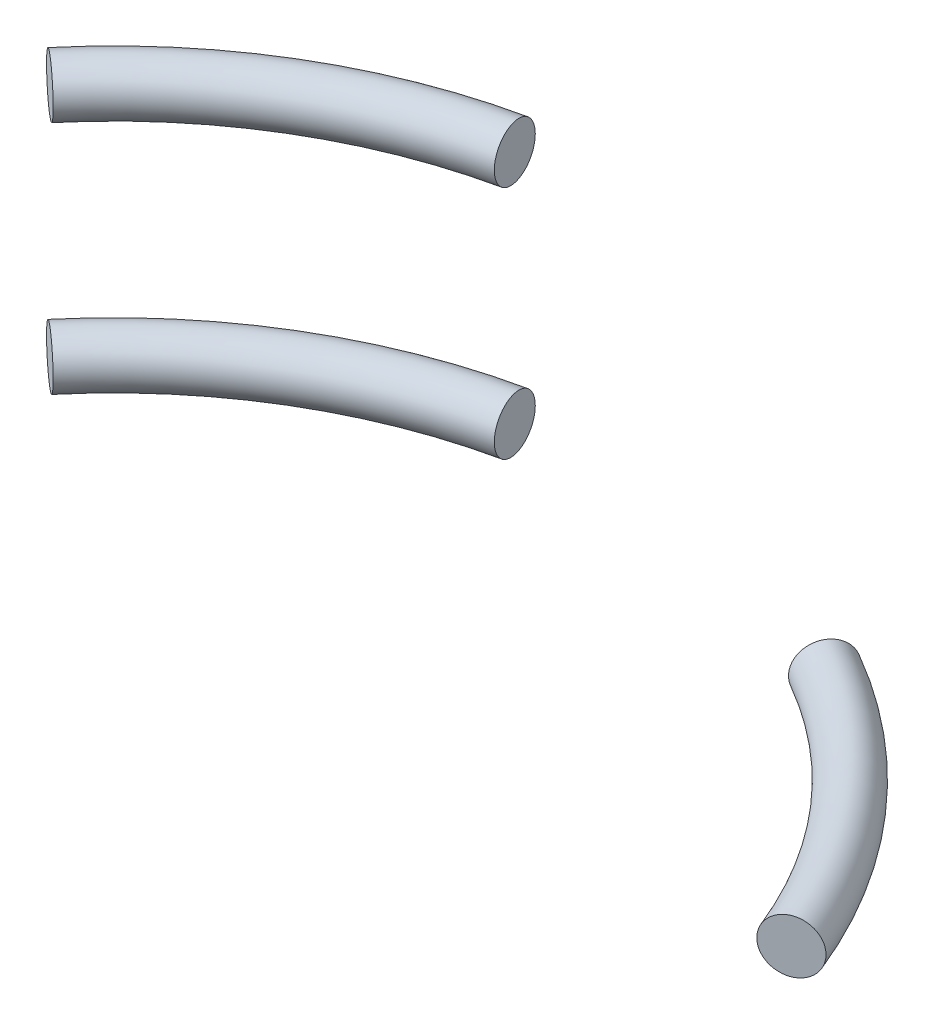
ISO-10303-21;
HEADER;
FILE_DESCRIPTION(('STEP AP214'),'2;1');
FILE_NAME('part.step','',(''),(''),'','','');
FILE_SCHEMA(('AUTOMOTIVE_DESIGN { 1 0 10303 214 1 1 1 1 }'));
ENDSEC;
DATA;
#1=APPLICATION_CONTEXT('core data for automotive mechanical design processes');
#2=APPLICATION_PROTOCOL_DEFINITION('international standard','automotive_design',2000,#1);
#3=PRODUCT_CONTEXT('',#1,'mechanical');
#4=PRODUCT('Part','Part','',(#3));
#5=PRODUCT_RELATED_PRODUCT_CATEGORY('part','',(#4));
#6=PRODUCT_DEFINITION_FORMATION('','',#4);
#7=PRODUCT_DEFINITION_CONTEXT('part definition',#1,'design');
#8=PRODUCT_DEFINITION('design','',#6,#7);
#9=PRODUCT_DEFINITION_SHAPE('','',#8);
#10=(LENGTH_UNIT() NAMED_UNIT(*) SI_UNIT(.MILLI.,.METRE.));
#11=(NAMED_UNIT(*) PLANE_ANGLE_UNIT() SI_UNIT($,.RADIAN.));
#12=(NAMED_UNIT(*) SI_UNIT($,.STERADIAN.) SOLID_ANGLE_UNIT());
#13=UNCERTAINTY_MEASURE_WITH_UNIT(LENGTH_MEASURE(1.E-05),#10,'distance_accuracy_value','');
#14=(GEOMETRIC_REPRESENTATION_CONTEXT(3) GLOBAL_UNCERTAINTY_ASSIGNED_CONTEXT((#13)) GLOBAL_UNIT_ASSIGNED_CONTEXT((#10,
#11,#12)) REPRESENTATION_CONTEXT('',''));
#15=CARTESIAN_POINT('',(0.,0.,0.));
#16=DIRECTION('',(0.,0.,1.));
#17=DIRECTION('',(1.,0.,0.));
#18=AXIS2_PLACEMENT_3D('',#15,#16,#17);
#19=CARTESIAN_POINT('',(0.,5.,0.));
#20=DIRECTION('',(-0.866025403784443,0.,-0.499999999999992));
#21=DIRECTION('',(-0.499999999999992,0.,0.866025403784443));
#22=AXIS2_PLACEMENT_3D('',#19,#20,#21);
#23=PLANE('',#22);
#24=CARTESIAN_POINT('',(3.91249999999994,0.7302,-6.77664878461327));
#25=DIRECTION('',(0.866025403784443,0.,0.499999999999992));
#26=DIRECTION('',(-0.499999999999992,0.,0.866025403784444));
#27=AXIS2_PLACEMENT_3D('',#24,#25,#26);
#28=CIRCLE('',#27,0.4);
#29=CARTESIAN_POINT('',(4.11249999999993,0.7302,-7.12305894612705));
#30=VERTEX_POINT('',#29);
#31=EDGE_CURVE('P0_E18',#30,#30,#28,.T.);
#32=ORIENTED_EDGE('',*,*,#31,.F.);
#33=EDGE_LOOP('',(#32));
#34=FACE_BOUND('',#33,.T.);
#35=ADVANCED_FACE('P0_F15',(#34),#23,.T.);
#36=CARTESIAN_POINT('',(0.,5.,0.));
#37=DIRECTION('',(-0.37460659341592,0.,-0.927183854566784));
#38=DIRECTION('',(-0.927183854566784,0.,0.37460659341592));
#39=AXIS2_PLACEMENT_3D('',#36,#37,#38);
#40=PLANE('',#39);
#41=CARTESIAN_POINT('',(7.25521366198509,0.7302,-2.93129659347957));
#42=DIRECTION('',(0.37460659341592,0.,0.927183854566785));
#43=DIRECTION('',(-0.927183854566785,0.,0.374606593415919));
#44=AXIS2_PLACEMENT_3D('',#41,#42,#43);
#45=CIRCLE('',#44,0.4);
#46=CARTESIAN_POINT('',(7.6260872038118,0.7302,-3.08113923084594));
#47=VERTEX_POINT('',#46);
#48=EDGE_CURVE('P0_E10',#47,#47,#45,.T.);
#49=ORIENTED_EDGE('',*,*,#48,.T.);
#50=EDGE_LOOP('',(#49));
#51=FACE_BOUND('',#50,.T.);
#52=ADVANCED_FACE('P0_F36',(#51),#40,.F.);
#53=CARTESIAN_POINT('',(0.,0.7302,0.));
#54=DIRECTION('',(0.,-1.,0.));
#55=DIRECTION('',(-0.866025403784443,0.,-0.499999999999992));
#56=AXIS2_PLACEMENT_3D('',#53,#54,#55);
#57=TOROIDAL_SURFACE('',#56,7.825,0.4);
#58=CARTESIAN_POINT('',(0.,0.7302,0.));
#59=DIRECTION('',(0.,-1.,0.));
#60=DIRECTION('',(-0.866025403784443,0.,-0.499999999999992));
#61=AXIS2_PLACEMENT_3D('',#58,#59,#60);
#62=CIRCLE('',#61,8.225);
#63=EDGE_CURVE('',#30,#47,#62,.T.);
#64=ORIENTED_EDGE('',*,*,#31,.T.);
#65=ORIENTED_EDGE('',*,*,#48,.F.);
#66=ORIENTED_EDGE('',*,*,#63,.T.);
#67=ORIENTED_EDGE('',*,*,#63,.F.);
#68=EDGE_LOOP('',(#64,#66,#65,#67));
#69=FACE_BOUND('',#68,.T.);
#70=ADVANCED_FACE('P0_F33',(#69),#57,.T.);
#71=CLOSED_SHELL('',(#35,#52,#70));
#72=MANIFOLD_SOLID_BREP('P0_B1',#71);
#73=CARTESIAN_POINT('',(0.,5.,0.));
#74=DIRECTION('',(-0.64278760968653,0.,0.766044443118986));
#75=DIRECTION('',(0.766044443118986,0.,0.64278760968653));
#76=AXIS2_PLACEMENT_3D('',#73,#74,#75);
#77=PLANE('',#76);
#78=CARTESIAN_POINT('',(-5.99429776740606,0.7302,-5.0298130457971));
#79=DIRECTION('',(0.64278760968653,0.,-0.766044443118986));
#80=DIRECTION('',(0.766044443118986,0.,0.64278760968653));
#81=AXIS2_PLACEMENT_3D('',#78,#79,#80);
#82=CIRCLE('',#81,0.4);
#83=CARTESIAN_POINT('',(-6.30071554465365,0.7302,-5.28692808967171));
#84=VERTEX_POINT('',#83);
#85=EDGE_CURVE('P1_E18',#84,#84,#82,.T.);
#86=ORIENTED_EDGE('',*,*,#85,.F.);
#87=EDGE_LOOP('',(#86));
#88=FACE_BOUND('',#87,.T.);
#89=ADVANCED_FACE('P1_F15',(#88),#77,.T.);
#90=CARTESIAN_POINT('',(0.,5.,0.));
#91=DIRECTION('',(-0.978147600733803,0.,0.20791169081777));
#92=DIRECTION('',(0.20791169081777,0.,0.978147600733803));
#93=AXIS2_PLACEMENT_3D('',#90,#91,#92);
#94=PLANE('',#93);
#95=CARTESIAN_POINT('',(-1.62690898064905,0.7302,-7.65400497574201));
#96=DIRECTION('',(0.978147600733803,0.,-0.20791169081777));
#97=DIRECTION('',(0.20791169081777,0.,0.978147600733803));
#98=AXIS2_PLACEMENT_3D('',#95,#96,#97);
#99=CIRCLE('',#98,0.4);
#100=CARTESIAN_POINT('',(-1.71007365697616,0.7302,-8.04526401603553));
#101=VERTEX_POINT('',#100);
#102=EDGE_CURVE('P1_E10',#101,#101,#99,.T.);
#103=ORIENTED_EDGE('',*,*,#102,.T.);
#104=EDGE_LOOP('',(#103));
#105=FACE_BOUND('',#104,.T.);
#106=ADVANCED_FACE('P1_F36',(#105),#94,.F.);
#107=CARTESIAN_POINT('',(0.,0.7302,0.));
#108=DIRECTION('',(0.,-1.,0.));
#109=DIRECTION('',(-0.64278760968653,0.,0.766044443118986));
#110=AXIS2_PLACEMENT_3D('',#107,#108,#109);
#111=TOROIDAL_SURFACE('',#110,7.825,0.4);
#112=CARTESIAN_POINT('',(0.,0.7302,0.));
#113=DIRECTION('',(0.,-1.,0.));
#114=DIRECTION('',(-0.64278760968653,0.,0.766044443118986));
#115=AXIS2_PLACEMENT_3D('',#112,#113,#114);
#116=CIRCLE('',#115,8.225);
#117=EDGE_CURVE('',#84,#101,#116,.T.);
#118=ORIENTED_EDGE('',*,*,#85,.T.);
#119=ORIENTED_EDGE('',*,*,#102,.F.);
#120=ORIENTED_EDGE('',*,*,#117,.T.);
#121=ORIENTED_EDGE('',*,*,#117,.F.);
#122=EDGE_LOOP('',(#118,#120,#119,#121));
#123=FACE_BOUND('',#122,.T.);
#124=ADVANCED_FACE('P1_F33',(#123),#111,.T.);
#125=CLOSED_SHELL('',(#89,#106,#124));
#126=MANIFOLD_SOLID_BREP('P1_B1',#125);
#127=CARTESIAN_POINT('',(0.,0.,0.));
#128=DIRECTION('',(-0.64278760968653,0.,0.766044443118986));
#129=DIRECTION('',(0.766044443118986,0.,0.64278760968653));
#130=AXIS2_PLACEMENT_3D('',#127,#128,#129);
#131=PLANE('',#130);
#132=CARTESIAN_POINT('',(-5.99429776740606,4.2698,-5.0298130457971));
#133=DIRECTION('',(-0.64278760968653,0.,0.766044443118986));
#134=DIRECTION('',(0.766044443118986,0.,0.64278760968653));
#135=AXIS2_PLACEMENT_3D('',#132,#133,#134);
#136=CIRCLE('',#135,0.4);
#137=CARTESIAN_POINT('',(-6.30071554465365,4.2698,-5.28692808967171));
#138=VERTEX_POINT('',#137);
#139=EDGE_CURVE('P2_E10',#138,#138,#136,.T.);
#140=ORIENTED_EDGE('',*,*,#139,.T.);
#141=EDGE_LOOP('',(#140));
#142=FACE_BOUND('',#141,.T.);
#143=ADVANCED_FACE('P2_F15',(#142),#131,.T.);
#144=CARTESIAN_POINT('',(0.,0.,0.));
#145=DIRECTION('',(-0.978147600733803,0.,0.20791169081777));
#146=DIRECTION('',(0.20791169081777,0.,0.978147600733803));
#147=AXIS2_PLACEMENT_3D('',#144,#145,#146);
#148=PLANE('',#147);
#149=CARTESIAN_POINT('',(-1.62690898064905,4.2698,-7.65400497574201));
#150=DIRECTION('',(-0.978147600733803,0.,0.20791169081777));
#151=DIRECTION('',(0.20791169081777,0.,0.978147600733803));
#152=AXIS2_PLACEMENT_3D('',#149,#150,#151);
#153=CIRCLE('',#152,0.4);
#154=CARTESIAN_POINT('',(-1.71007365697616,4.2698,-8.04526401603553));
#155=VERTEX_POINT('',#154);
#156=EDGE_CURVE('P2_E22',#155,#155,#153,.T.);
#157=ORIENTED_EDGE('',*,*,#156,.F.);
#158=EDGE_LOOP('',(#157));
#159=FACE_BOUND('',#158,.T.);
#160=ADVANCED_FACE('P2_F35',(#159),#148,.F.);
#161=CARTESIAN_POINT('',(0.,4.2698,0.));
#162=DIRECTION('',(0.,1.,0.));
#163=DIRECTION('',(-0.64278760968653,0.,0.766044443118986));
#164=AXIS2_PLACEMENT_3D('',#161,#162,#163);
#165=TOROIDAL_SURFACE('',#164,7.825,0.4);
#166=CARTESIAN_POINT('',(0.,4.2698,0.));
#167=DIRECTION('',(0.,1.,0.));
#168=DIRECTION('',(-0.64278760968653,0.,0.766044443118986));
#169=AXIS2_PLACEMENT_3D('',#166,#167,#168);
#170=CIRCLE('',#169,8.225);
#171=EDGE_CURVE('',#155,#138,#170,.T.);
#172=ORIENTED_EDGE('',*,*,#156,.T.);
#173=ORIENTED_EDGE('',*,*,#139,.F.);
#174=ORIENTED_EDGE('',*,*,#171,.T.);
#175=ORIENTED_EDGE('',*,*,#171,.F.);
#176=EDGE_LOOP('',(#172,#174,#173,#175));
#177=FACE_BOUND('',#176,.T.);
#178=ADVANCED_FACE('P2_F33',(#177),#165,.T.);
#179=CLOSED_SHELL('',(#143,#160,#178));
#180=MANIFOLD_SOLID_BREP('P2_B1',#179);
#181=ADVANCED_BREP_SHAPE_REPRESENTATION('',(#18,#72,#126,#180),#14);
#182=SHAPE_DEFINITION_REPRESENTATION(#9,#181);
ENDSEC;
END-ISO-10303-21;
